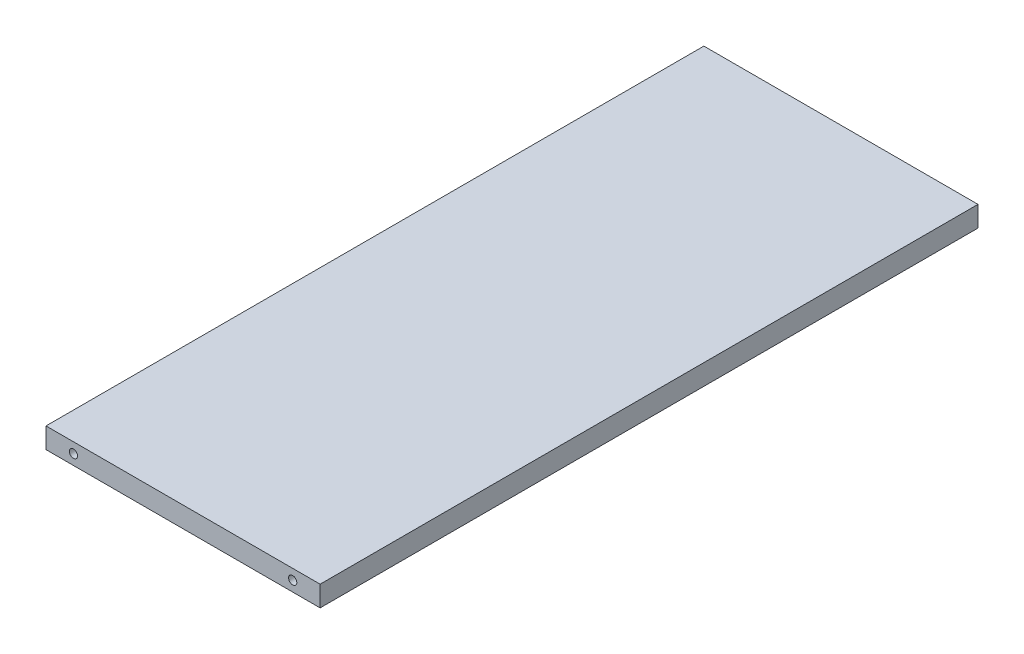
ISO-10303-21;
HEADER;
FILE_DESCRIPTION(('STEP AP214'),'2;1');
FILE_NAME('part.step','',(''),(''),'','','');
FILE_SCHEMA(('AUTOMOTIVE_DESIGN { 1 0 10303 214 1 1 1 1 }'));
ENDSEC;
DATA;
#1=APPLICATION_CONTEXT('core data for automotive mechanical design processes');
#2=APPLICATION_PROTOCOL_DEFINITION('international standard','automotive_design',2000,#1);
#3=PRODUCT_CONTEXT('',#1,'mechanical');
#4=PRODUCT('Part','Part','',(#3));
#5=PRODUCT_RELATED_PRODUCT_CATEGORY('part','',(#4));
#6=PRODUCT_DEFINITION_FORMATION('','',#4);
#7=PRODUCT_DEFINITION_CONTEXT('part definition',#1,'design');
#8=PRODUCT_DEFINITION('design','',#6,#7);
#9=PRODUCT_DEFINITION_SHAPE('','',#8);
#10=(LENGTH_UNIT() NAMED_UNIT(*) SI_UNIT(.MILLI.,.METRE.));
#11=(NAMED_UNIT(*) PLANE_ANGLE_UNIT() SI_UNIT($,.RADIAN.));
#12=(NAMED_UNIT(*) SI_UNIT($,.STERADIAN.) SOLID_ANGLE_UNIT());
#13=UNCERTAINTY_MEASURE_WITH_UNIT(LENGTH_MEASURE(1.E-05),#10,'distance_accuracy_value','');
#14=(GEOMETRIC_REPRESENTATION_CONTEXT(3) GLOBAL_UNCERTAINTY_ASSIGNED_CONTEXT((#13)) GLOBAL_UNIT_ASSIGNED_CONTEXT((#10,
#11,#12)) REPRESENTATION_CONTEXT('',''));
#15=CARTESIAN_POINT('',(0.,0.,0.));
#16=DIRECTION('',(0.,0.,1.));
#17=DIRECTION('',(1.,0.,0.));
#18=AXIS2_PLACEMENT_3D('',#15,#16,#17);
#19=CARTESIAN_POINT('',(-39.6182275162785,9.525,-34.1736173020531));
#20=DIRECTION('',(1.,0.,0.));
#21=DIRECTION('',(0.,0.,-1.));
#22=AXIS2_PLACEMENT_3D('',#19,#20,#21);
#23=PLANE('',#22);
#24=DIRECTION('',(0.,0.,1.));
#25=VECTOR('',#24,1.);
#26=CARTESIAN_POINT('',(-39.6182275162785,0.,-34.1736173020531));
#27=LINE('',#26,#25);
#28=CARTESIAN_POINT('',(-39.6182275162785,0.,-34.1736173020531));
#29=VERTEX_POINT('',#28);
#30=CARTESIAN_POINT('',(-39.6182275162785,0.,270.626382697947));
#31=VERTEX_POINT('',#30);
#32=EDGE_CURVE('E130',#29,#31,#27,.T.);
#33=ORIENTED_EDGE('',*,*,#32,.T.);
#34=DIRECTION('',(0.,-1.,0.));
#35=VECTOR('',#34,1.);
#36=CARTESIAN_POINT('',(-39.6182275162785,9.525,270.626382697947));
#37=LINE('',#36,#35);
#38=CARTESIAN_POINT('',(-39.6182275162785,9.525,270.626382697947));
#39=VERTEX_POINT('',#38);
#40=EDGE_CURVE('E11',#39,#31,#37,.T.);
#41=ORIENTED_EDGE('',*,*,#40,.F.);
#42=DIRECTION('',(0.,0.,1.));
#43=VECTOR('',#42,1.);
#44=CARTESIAN_POINT('',(-39.6182275162785,9.525,-34.1736173020531));
#45=LINE('',#44,#43);
#46=CARTESIAN_POINT('',(-39.6182275162785,9.525,-34.1736173020531));
#47=VERTEX_POINT('',#46);
#48=EDGE_CURVE('E131',#47,#39,#45,.T.);
#49=ORIENTED_EDGE('',*,*,#48,.F.);
#50=DIRECTION('',(0.,-1.,0.));
#51=VECTOR('',#50,1.);
#52=CARTESIAN_POINT('',(-39.6182275162785,9.525,-34.1736173020531));
#53=LINE('',#52,#51);
#54=EDGE_CURVE('E137',#47,#29,#53,.T.);
#55=ORIENTED_EDGE('',*,*,#54,.T.);
#56=EDGE_LOOP('',(#33,#41,#49,#55));
#57=FACE_BOUND('',#56,.T.);
#58=ADVANCED_FACE('F37',(#57),#23,.F.);
#59=CARTESIAN_POINT('',(-39.6182275162785,9.525,270.626382697947));
#60=DIRECTION('',(0.,0.,-1.));
#61=DIRECTION('',(-1.,0.,0.));
#62=AXIS2_PLACEMENT_3D('',#59,#60,#61);
#63=PLANE('',#62);
#64=CARTESIAN_POINT('',(-26.9182275162785,4.7625,270.626382697947));
#65=DIRECTION('',(0.,0.,1.));
#66=DIRECTION('',(1.,0.,0.));
#67=AXIS2_PLACEMENT_3D('',#64,#65,#66);
#68=CIRCLE('',#67,1.89865);
#69=CARTESIAN_POINT('',(-25.0195775162785,4.7625,270.626382697947));
#70=VERTEX_POINT('',#69);
#71=EDGE_CURVE('E118',#70,#70,#68,.T.);
#72=ORIENTED_EDGE('',*,*,#71,.F.);
#73=EDGE_LOOP('',(#72));
#74=FACE_BOUND('',#73,.T.);
#75=CARTESIAN_POINT('',(74.6817724837215,4.7625,270.626382697947));
#76=DIRECTION('',(0.,0.,1.));
#77=DIRECTION('',(1.,0.,0.));
#78=AXIS2_PLACEMENT_3D('',#75,#76,#77);
#79=CIRCLE('',#78,1.89865);
#80=CARTESIAN_POINT('',(76.5804224837215,4.7625,270.626382697947));
#81=VERTEX_POINT('',#80);
#82=EDGE_CURVE('E124',#81,#81,#79,.T.);
#83=ORIENTED_EDGE('',*,*,#82,.F.);
#84=EDGE_LOOP('',(#83));
#85=FACE_BOUND('',#84,.T.);
#86=DIRECTION('',(1.,0.,0.));
#87=VECTOR('',#86,1.);
#88=CARTESIAN_POINT('',(-39.6182275162785,0.,270.626382697947));
#89=LINE('',#88,#87);
#90=CARTESIAN_POINT('',(87.3817724837215,0.,270.626382697947));
#91=VERTEX_POINT('',#90);
#92=EDGE_CURVE('E140',#31,#91,#89,.T.);
#93=ORIENTED_EDGE('',*,*,#92,.T.);
#94=DIRECTION('',(0.,-1.,0.));
#95=VECTOR('',#94,1.);
#96=CARTESIAN_POINT('',(87.3817724837215,9.525,270.626382697947));
#97=LINE('',#96,#95);
#98=CARTESIAN_POINT('',(87.3817724837215,9.525,270.626382697947));
#99=VERTEX_POINT('',#98);
#100=EDGE_CURVE('E45',#99,#91,#97,.T.);
#101=ORIENTED_EDGE('',*,*,#100,.F.);
#102=DIRECTION('',(1.,0.,0.));
#103=VECTOR('',#102,1.);
#104=CARTESIAN_POINT('',(-39.6182275162785,9.525,270.626382697947));
#105=LINE('',#104,#103);
#106=EDGE_CURVE('E84',#39,#99,#105,.T.);
#107=ORIENTED_EDGE('',*,*,#106,.F.);
#108=ORIENTED_EDGE('',*,*,#40,.T.);
#109=EDGE_LOOP('',(#93,#101,#107,#108));
#110=FACE_BOUND('',#109,.T.);
#111=ADVANCED_FACE('F164',(#74,#85,#110),#63,.F.);
#112=CARTESIAN_POINT('',(87.3817724837215,9.525,-34.1736173020531));
#113=DIRECTION('',(-1.,0.,0.));
#114=DIRECTION('',(0.,0.,1.));
#115=AXIS2_PLACEMENT_3D('',#112,#113,#114);
#116=PLANE('',#115);
#117=DIRECTION('',(0.,0.,-1.));
#118=VECTOR('',#117,1.);
#119=CARTESIAN_POINT('',(87.3817724837215,0.,-34.1736173020531));
#120=LINE('',#119,#118);
#121=CARTESIAN_POINT('',(87.3817724837215,0.,-34.1736173020531));
#122=VERTEX_POINT('',#121);
#123=EDGE_CURVE('E71',#91,#122,#120,.T.);
#124=ORIENTED_EDGE('',*,*,#123,.T.);
#125=DIRECTION('',(0.,-1.,0.));
#126=VECTOR('',#125,1.);
#127=CARTESIAN_POINT('',(87.3817724837215,9.525,-34.1736173020531));
#128=LINE('',#127,#126);
#129=CARTESIAN_POINT('',(87.3817724837215,9.525,-34.1736173020531));
#130=VERTEX_POINT('',#129);
#131=EDGE_CURVE('E145',#130,#122,#128,.T.);
#132=ORIENTED_EDGE('',*,*,#131,.F.);
#133=DIRECTION('',(0.,0.,-1.));
#134=VECTOR('',#133,1.);
#135=CARTESIAN_POINT('',(87.3817724837215,9.525,-34.1736173020531));
#136=LINE('',#135,#134);
#137=EDGE_CURVE('E134',#99,#130,#136,.T.);
#138=ORIENTED_EDGE('',*,*,#137,.F.);
#139=ORIENTED_EDGE('',*,*,#100,.T.);
#140=EDGE_LOOP('',(#124,#132,#138,#139));
#141=FACE_BOUND('',#140,.T.);
#142=ADVANCED_FACE('F147',(#141),#116,.F.);
#143=CARTESIAN_POINT('',(-39.6182275162785,9.525,-34.1736173020531));
#144=DIRECTION('',(0.,0.,1.));
#145=DIRECTION('',(1.,0.,0.));
#146=AXIS2_PLACEMENT_3D('',#143,#144,#145);
#147=PLANE('',#146);
#148=CARTESIAN_POINT('',(74.6817724837215,4.7625,-34.1736173020531));
#149=DIRECTION('',(0.,0.,-1.));
#150=DIRECTION('',(-1.,0.,0.));
#151=AXIS2_PLACEMENT_3D('',#148,#149,#150);
#152=CIRCLE('',#151,1.89864999999999);
#153=CARTESIAN_POINT('',(72.7831224837215,4.7625,-34.1736173020531));
#154=VERTEX_POINT('',#153);
#155=EDGE_CURVE('E108',#154,#154,#152,.T.);
#156=ORIENTED_EDGE('',*,*,#155,.F.);
#157=EDGE_LOOP('',(#156));
#158=FACE_BOUND('',#157,.T.);
#159=CARTESIAN_POINT('',(-26.9182275162785,4.7625,-34.1736173020531));
#160=DIRECTION('',(0.,0.,-1.));
#161=DIRECTION('',(-1.,0.,0.));
#162=AXIS2_PLACEMENT_3D('',#159,#160,#161);
#163=CIRCLE('',#162,1.89864999999999);
#164=CARTESIAN_POINT('',(-28.8168775162785,4.7625,-34.1736173020531));
#165=VERTEX_POINT('',#164);
#166=EDGE_CURVE('E107',#165,#165,#163,.T.);
#167=ORIENTED_EDGE('',*,*,#166,.F.);
#168=EDGE_LOOP('',(#167));
#169=FACE_BOUND('',#168,.T.);
#170=DIRECTION('',(-1.,0.,0.));
#171=VECTOR('',#170,1.);
#172=CARTESIAN_POINT('',(-39.6182275162785,0.,-34.1736173020531));
#173=LINE('',#172,#171);
#174=EDGE_CURVE('E77',#122,#29,#173,.T.);
#175=ORIENTED_EDGE('',*,*,#174,.T.);
#176=ORIENTED_EDGE('',*,*,#54,.F.);
#177=DIRECTION('',(-1.,0.,0.));
#178=VECTOR('',#177,1.);
#179=CARTESIAN_POINT('',(-39.6182275162785,9.525,-34.1736173020531));
#180=LINE('',#179,#178);
#181=EDGE_CURVE('E53',#130,#47,#180,.T.);
#182=ORIENTED_EDGE('',*,*,#181,.F.);
#183=ORIENTED_EDGE('',*,*,#131,.T.);
#184=EDGE_LOOP('',(#175,#176,#182,#183));
#185=FACE_BOUND('',#184,.T.);
#186=ADVANCED_FACE('F154',(#158,#169,#185),#147,.F.);
#187=CARTESIAN_POINT('',(0.,9.525,0.));
#188=DIRECTION('',(0.,1.,0.));
#189=DIRECTION('',(0.,0.,1.));
#190=AXIS2_PLACEMENT_3D('',#187,#188,#189);
#191=PLANE('',#190);
#192=ORIENTED_EDGE('',*,*,#48,.T.);
#193=ORIENTED_EDGE('',*,*,#106,.T.);
#194=ORIENTED_EDGE('',*,*,#137,.T.);
#195=ORIENTED_EDGE('',*,*,#181,.T.);
#196=EDGE_LOOP('',(#192,#193,#194,#195));
#197=FACE_BOUND('',#196,.T.);
#198=ADVANCED_FACE('F156',(#197),#191,.T.);
#199=CARTESIAN_POINT('',(0.,0.,0.));
#200=DIRECTION('',(0.,1.,0.));
#201=DIRECTION('',(0.,0.,1.));
#202=AXIS2_PLACEMENT_3D('',#199,#200,#201);
#203=PLANE('',#202);
#204=ORIENTED_EDGE('',*,*,#32,.F.);
#205=ORIENTED_EDGE('',*,*,#174,.F.);
#206=ORIENTED_EDGE('',*,*,#123,.F.);
#207=ORIENTED_EDGE('',*,*,#92,.F.);
#208=EDGE_LOOP('',(#204,#205,#206,#207));
#209=FACE_BOUND('',#208,.T.);
#210=ADVANCED_FACE('F150',(#209),#203,.F.);
#211=CARTESIAN_POINT('',(74.6817724837215,4.7625,246.242382697947));
#212=DIRECTION('',(0.,0.,1.));
#213=DIRECTION('',(1.,0.,0.));
#214=AXIS2_PLACEMENT_3D('',#211,#212,#213);
#215=CONICAL_SURFACE('',#214,1.89865,1.02974425867665);
#216=CARTESIAN_POINT('',(74.6817724837215,4.7625,245.10155868363));
#217=VERTEX_POINT('',#216);
#218=VERTEX_LOOP('',#217);
#219=FACE_BOUND('',#218,.T.);
#220=CARTESIAN_POINT('',(74.6817724837215,4.7625,246.242382697947));
#221=DIRECTION('',(0.,0.,1.));
#222=DIRECTION('',(1.,0.,0.));
#223=AXIS2_PLACEMENT_3D('',#220,#221,#222);
#224=CIRCLE('',#223,1.89865);
#225=CARTESIAN_POINT('',(76.5804224837215,4.7625,246.242382697947));
#226=VERTEX_POINT('',#225);
#227=EDGE_CURVE('E127',#226,#226,#224,.T.);
#228=ORIENTED_EDGE('',*,*,#227,.T.);
#229=EDGE_LOOP('',(#228));
#230=FACE_BOUND('',#229,.T.);
#231=ADVANCED_FACE('F183',(#219,#230),#215,.F.);
#232=CARTESIAN_POINT('',(74.6817724837215,4.7625,270.626382697947));
#233=DIRECTION('',(0.,0.,1.));
#234=DIRECTION('',(1.,0.,0.));
#235=AXIS2_PLACEMENT_3D('',#232,#233,#234);
#236=CYLINDRICAL_SURFACE('',#235,1.89865);
#237=ORIENTED_EDGE('',*,*,#227,.F.);
#238=EDGE_LOOP('',(#237));
#239=FACE_BOUND('',#238,.T.);
#240=ORIENTED_EDGE('',*,*,#82,.T.);
#241=EDGE_LOOP('',(#240));
#242=FACE_BOUND('',#241,.T.);
#243=ADVANCED_FACE('F180',(#239,#242),#236,.F.);
#244=CARTESIAN_POINT('',(-26.9182275162785,4.7625,246.242382697947));
#245=DIRECTION('',(0.,0.,1.));
#246=DIRECTION('',(1.,0.,0.));
#247=AXIS2_PLACEMENT_3D('',#244,#245,#246);
#248=CONICAL_SURFACE('',#247,1.89864999999999,1.02974425867664);
#249=CARTESIAN_POINT('',(-26.9182275162785,4.7625,245.10155868363));
#250=VERTEX_POINT('',#249);
#251=VERTEX_LOOP('',#250);
#252=FACE_BOUND('',#251,.T.);
#253=CARTESIAN_POINT('',(-26.9182275162785,4.7625,246.242382697947));
#254=DIRECTION('',(0.,0.,1.));
#255=DIRECTION('',(1.,0.,0.));
#256=AXIS2_PLACEMENT_3D('',#253,#254,#255);
#257=CIRCLE('',#256,1.89864999999999);
#258=CARTESIAN_POINT('',(-25.0195775162785,4.7625,246.242382697947));
#259=VERTEX_POINT('',#258);
#260=EDGE_CURVE('E121',#259,#259,#257,.T.);
#261=ORIENTED_EDGE('',*,*,#260,.T.);
#262=EDGE_LOOP('',(#261));
#263=FACE_BOUND('',#262,.T.);
#264=ADVANCED_FACE('F182',(#252,#263),#248,.F.);
#265=CARTESIAN_POINT('',(-26.9182275162785,4.7625,270.626382697947));
#266=DIRECTION('',(0.,0.,1.));
#267=DIRECTION('',(1.,0.,0.));
#268=AXIS2_PLACEMENT_3D('',#265,#266,#267);
#269=CYLINDRICAL_SURFACE('',#268,1.89865);
#270=ORIENTED_EDGE('',*,*,#260,.F.);
#271=EDGE_LOOP('',(#270));
#272=FACE_BOUND('',#271,.T.);
#273=ORIENTED_EDGE('',*,*,#71,.T.);
#274=EDGE_LOOP('',(#273));
#275=FACE_BOUND('',#274,.T.);
#276=ADVANCED_FACE('F190',(#272,#275),#269,.F.);
#277=CARTESIAN_POINT('',(-26.9182275162785,4.7625,-9.78961730205308));
#278=DIRECTION('',(0.,0.,-1.));
#279=DIRECTION('',(-1.,0.,0.));
#280=AXIS2_PLACEMENT_3D('',#277,#278,#279);
#281=CONICAL_SURFACE('',#280,1.89864999999999,1.02974425867665);
#282=CARTESIAN_POINT('',(-26.9182275162785,4.7625,-8.6487932877364));
#283=VERTEX_POINT('',#282);
#284=VERTEX_LOOP('',#283);
#285=FACE_BOUND('',#284,.T.);
#286=CARTESIAN_POINT('',(-26.9182275162785,4.7625,-9.78961730205308));
#287=DIRECTION('',(0.,0.,-1.));
#288=DIRECTION('',(-1.,0.,0.));
#289=AXIS2_PLACEMENT_3D('',#286,#287,#288);
#290=CIRCLE('',#289,1.89864999999999);
#291=CARTESIAN_POINT('',(-28.8168775162785,4.7625,-9.78961730205308));
#292=VERTEX_POINT('',#291);
#293=EDGE_CURVE('E111',#292,#292,#290,.T.);
#294=ORIENTED_EDGE('',*,*,#293,.T.);
#295=EDGE_LOOP('',(#294));
#296=FACE_BOUND('',#295,.T.);
#297=ADVANCED_FACE('F231',(#285,#296),#281,.F.);
#298=CARTESIAN_POINT('',(-26.9182275162785,4.7625,-34.1736173020531));
#299=DIRECTION('',(0.,0.,-1.));
#300=DIRECTION('',(-1.,0.,0.));
#301=AXIS2_PLACEMENT_3D('',#298,#299,#300);
#302=CYLINDRICAL_SURFACE('',#301,1.89864999999999);
#303=ORIENTED_EDGE('',*,*,#293,.F.);
#304=EDGE_LOOP('',(#303));
#305=FACE_BOUND('',#304,.T.);
#306=ORIENTED_EDGE('',*,*,#166,.T.);
#307=EDGE_LOOP('',(#306));
#308=FACE_BOUND('',#307,.T.);
#309=ADVANCED_FACE('F101',(#305,#308),#302,.F.);
#310=CARTESIAN_POINT('',(74.6817724837215,4.7625,-9.78961730205308));
#311=DIRECTION('',(0.,0.,-1.));
#312=DIRECTION('',(-1.,0.,0.));
#313=AXIS2_PLACEMENT_3D('',#310,#311,#312);
#314=CONICAL_SURFACE('',#313,1.89864999999999,1.02974425867665);
#315=CARTESIAN_POINT('',(74.6817724837215,4.7625,-8.6487932877364));
#316=VERTEX_POINT('',#315);
#317=VERTEX_LOOP('',#316);
#318=FACE_BOUND('',#317,.T.);
#319=CARTESIAN_POINT('',(74.6817724837215,4.7625,-9.78961730205308));
#320=DIRECTION('',(0.,0.,-1.));
#321=DIRECTION('',(-1.,0.,0.));
#322=AXIS2_PLACEMENT_3D('',#319,#320,#321);
#323=CIRCLE('',#322,1.89864999999999);
#324=CARTESIAN_POINT('',(72.7831224837215,4.7625,-9.78961730205308));
#325=VERTEX_POINT('',#324);
#326=EDGE_CURVE('E105',#325,#325,#323,.T.);
#327=ORIENTED_EDGE('',*,*,#326,.T.);
#328=EDGE_LOOP('',(#327));
#329=FACE_BOUND('',#328,.T.);
#330=ADVANCED_FACE('F97',(#318,#329),#314,.F.);
#331=CARTESIAN_POINT('',(74.6817724837215,4.7625,-34.1736173020531));
#332=DIRECTION('',(0.,0.,-1.));
#333=DIRECTION('',(-1.,0.,0.));
#334=AXIS2_PLACEMENT_3D('',#331,#332,#333);
#335=CYLINDRICAL_SURFACE('',#334,1.89864999999999);
#336=ORIENTED_EDGE('',*,*,#326,.F.);
#337=EDGE_LOOP('',(#336));
#338=FACE_BOUND('',#337,.T.);
#339=ORIENTED_EDGE('',*,*,#155,.T.);
#340=EDGE_LOOP('',(#339));
#341=FACE_BOUND('',#340,.T.);
#342=ADVANCED_FACE('F100',(#338,#341),#335,.F.);
#343=CLOSED_SHELL('',(#58,#111,#142,#186,#198,#210,#231,#243,#264,#276,#297,#309,#330,#342));
#344=MANIFOLD_SOLID_BREP('B2',#343);
#345=ADVANCED_BREP_SHAPE_REPRESENTATION('',(#18,#344),#14);
#346=SHAPE_DEFINITION_REPRESENTATION(#9,#345);
ENDSEC;
END-ISO-10303-21;
